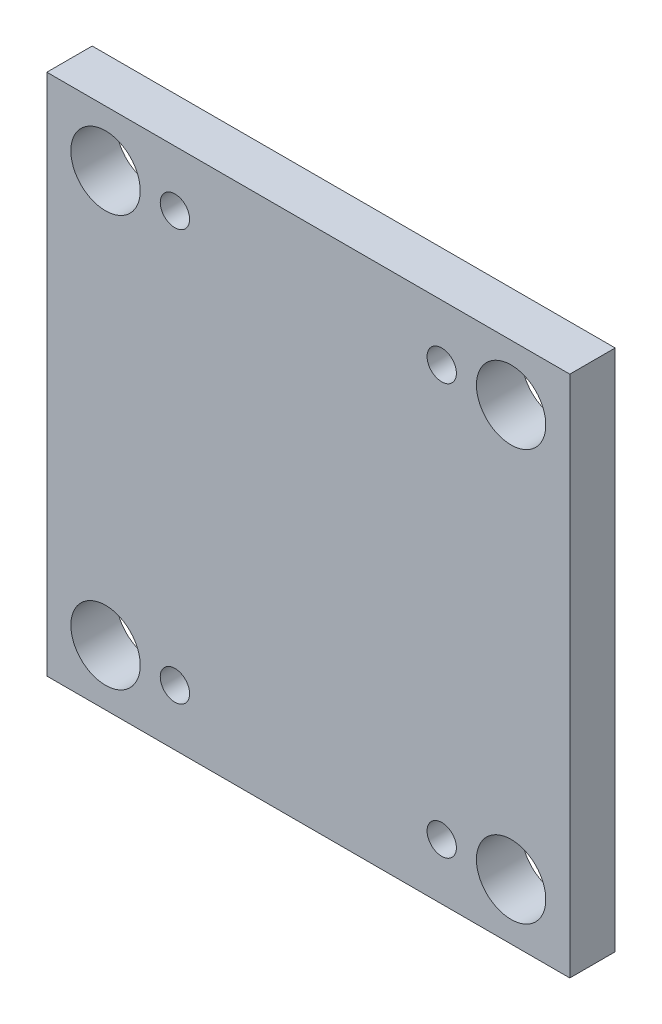
ISO-10303-21;
HEADER;
FILE_DESCRIPTION(('STEP AP214'),'2;1');
FILE_NAME('part.step','',(''),(''),'','','');
FILE_SCHEMA(('AUTOMOTIVE_DESIGN { 1 0 10303 214 1 1 1 1 }'));
ENDSEC;
DATA;
#1=APPLICATION_CONTEXT('core data for automotive mechanical design processes');
#2=APPLICATION_PROTOCOL_DEFINITION('international standard','automotive_design',2000,#1);
#3=PRODUCT_CONTEXT('',#1,'mechanical');
#4=PRODUCT('Part','Part','',(#3));
#5=PRODUCT_RELATED_PRODUCT_CATEGORY('part','',(#4));
#6=PRODUCT_DEFINITION_FORMATION('','',#4);
#7=PRODUCT_DEFINITION_CONTEXT('part definition',#1,'design');
#8=PRODUCT_DEFINITION('design','',#6,#7);
#9=PRODUCT_DEFINITION_SHAPE('','',#8);
#10=(LENGTH_UNIT() NAMED_UNIT(*) SI_UNIT(.MILLI.,.METRE.));
#11=(NAMED_UNIT(*) PLANE_ANGLE_UNIT() SI_UNIT($,.RADIAN.));
#12=(NAMED_UNIT(*) SI_UNIT($,.STERADIAN.) SOLID_ANGLE_UNIT());
#13=UNCERTAINTY_MEASURE_WITH_UNIT(LENGTH_MEASURE(1.E-05),#10,'distance_accuracy_value','');
#14=(GEOMETRIC_REPRESENTATION_CONTEXT(3) GLOBAL_UNCERTAINTY_ASSIGNED_CONTEXT((#13)) GLOBAL_UNIT_ASSIGNED_CONTEXT((#10,
#11,#12)) REPRESENTATION_CONTEXT('',''));
#15=CARTESIAN_POINT('',(0.,0.,0.));
#16=DIRECTION('',(0.,0.,1.));
#17=DIRECTION('',(1.,0.,0.));
#18=AXIS2_PLACEMENT_3D('',#15,#16,#17);
#19=CARTESIAN_POINT('',(98.,-98.,0.));
#20=DIRECTION('',(1.,0.,0.));
#21=DIRECTION('',(0.,0.,-1.));
#22=AXIS2_PLACEMENT_3D('',#19,#20,#21);
#23=PLANE('',#22);
#24=DIRECTION('',(0.,1.,0.));
#25=VECTOR('',#24,1.);
#26=CARTESIAN_POINT('',(98.,-98.,17.));
#27=LINE('',#26,#25);
#28=CARTESIAN_POINT('',(98.,-98.,17.));
#29=VERTEX_POINT('',#28);
#30=CARTESIAN_POINT('',(98.,98.,17.));
#31=VERTEX_POINT('',#30);
#32=EDGE_CURVE('E102',#29,#31,#27,.T.);
#33=ORIENTED_EDGE('',*,*,#32,.F.);
#34=DIRECTION('',(0.,0.,1.));
#35=VECTOR('',#34,1.);
#36=CARTESIAN_POINT('',(98.,-98.,0.));
#37=LINE('',#36,#35);
#38=CARTESIAN_POINT('',(98.,-98.,0.));
#39=VERTEX_POINT('',#38);
#40=EDGE_CURVE('E11',#39,#29,#37,.T.);
#41=ORIENTED_EDGE('',*,*,#40,.F.);
#42=DIRECTION('',(0.,1.,0.));
#43=VECTOR('',#42,1.);
#44=CARTESIAN_POINT('',(98.,-98.,0.));
#45=LINE('',#44,#43);
#46=CARTESIAN_POINT('',(98.,98.,0.));
#47=VERTEX_POINT('',#46);
#48=EDGE_CURVE('E95',#39,#47,#45,.T.);
#49=ORIENTED_EDGE('',*,*,#48,.T.);
#50=DIRECTION('',(0.,0.,1.));
#51=VECTOR('',#50,1.);
#52=CARTESIAN_POINT('',(98.,98.,0.));
#53=LINE('',#52,#51);
#54=EDGE_CURVE('E40',#47,#31,#53,.T.);
#55=ORIENTED_EDGE('',*,*,#54,.T.);
#56=EDGE_LOOP('',(#33,#41,#49,#55));
#57=FACE_BOUND('',#56,.T.);
#58=ADVANCED_FACE('F37',(#57),#23,.T.);
#59=CARTESIAN_POINT('',(-98.,-98.,0.));
#60=DIRECTION('',(0.,-1.,0.));
#61=DIRECTION('',(0.,0.,-1.));
#62=AXIS2_PLACEMENT_3D('',#59,#60,#61);
#63=PLANE('',#62);
#64=DIRECTION('',(1.,0.,0.));
#65=VECTOR('',#64,1.);
#66=CARTESIAN_POINT('',(-98.,-98.,17.));
#67=LINE('',#66,#65);
#68=CARTESIAN_POINT('',(-98.,-98.,17.));
#69=VERTEX_POINT('',#68);
#70=EDGE_CURVE('E97',#69,#29,#67,.T.);
#71=ORIENTED_EDGE('',*,*,#70,.F.);
#72=DIRECTION('',(0.,0.,1.));
#73=VECTOR('',#72,1.);
#74=CARTESIAN_POINT('',(-98.,-98.,0.));
#75=LINE('',#74,#73);
#76=CARTESIAN_POINT('',(-98.,-98.,0.));
#77=VERTEX_POINT('',#76);
#78=EDGE_CURVE('E46',#77,#69,#75,.T.);
#79=ORIENTED_EDGE('',*,*,#78,.F.);
#80=DIRECTION('',(1.,0.,0.));
#81=VECTOR('',#80,1.);
#82=CARTESIAN_POINT('',(-98.,-98.,0.));
#83=LINE('',#82,#81);
#84=EDGE_CURVE('E92',#77,#39,#83,.T.);
#85=ORIENTED_EDGE('',*,*,#84,.T.);
#86=ORIENTED_EDGE('',*,*,#40,.T.);
#87=EDGE_LOOP('',(#71,#79,#85,#86));
#88=FACE_BOUND('',#87,.T.);
#89=ADVANCED_FACE('F113',(#88),#63,.T.);
#90=CARTESIAN_POINT('',(-98.,98.,0.));
#91=DIRECTION('',(-1.,0.,0.));
#92=DIRECTION('',(0.,0.,1.));
#93=AXIS2_PLACEMENT_3D('',#90,#91,#92);
#94=PLANE('',#93);
#95=DIRECTION('',(0.,-1.,0.));
#96=VECTOR('',#95,1.);
#97=CARTESIAN_POINT('',(-98.,98.,17.));
#98=LINE('',#97,#96);
#99=CARTESIAN_POINT('',(-98.,98.,17.));
#100=VERTEX_POINT('',#99);
#101=EDGE_CURVE('E87',#100,#69,#98,.T.);
#102=ORIENTED_EDGE('',*,*,#101,.F.);
#103=DIRECTION('',(0.,0.,1.));
#104=VECTOR('',#103,1.);
#105=CARTESIAN_POINT('',(-98.,98.,0.));
#106=LINE('',#105,#104);
#107=CARTESIAN_POINT('',(-98.,98.,0.));
#108=VERTEX_POINT('',#107);
#109=EDGE_CURVE('E82',#108,#100,#106,.T.);
#110=ORIENTED_EDGE('',*,*,#109,.F.);
#111=DIRECTION('',(0.,-1.,0.));
#112=VECTOR('',#111,1.);
#113=CARTESIAN_POINT('',(-98.,98.,0.));
#114=LINE('',#113,#112);
#115=EDGE_CURVE('E85',#108,#77,#114,.T.);
#116=ORIENTED_EDGE('',*,*,#115,.T.);
#117=ORIENTED_EDGE('',*,*,#78,.T.);
#118=EDGE_LOOP('',(#102,#110,#116,#117));
#119=FACE_BOUND('',#118,.T.);
#120=ADVANCED_FACE('F84',(#119),#94,.T.);
#121=CARTESIAN_POINT('',(98.,98.,0.));
#122=DIRECTION('',(0.,1.,0.));
#123=DIRECTION('',(0.,0.,1.));
#124=AXIS2_PLACEMENT_3D('',#121,#122,#123);
#125=PLANE('',#124);
#126=DIRECTION('',(-1.,0.,0.));
#127=VECTOR('',#126,1.);
#128=CARTESIAN_POINT('',(98.,98.,17.));
#129=LINE('',#128,#127);
#130=EDGE_CURVE('E105',#31,#100,#129,.T.);
#131=ORIENTED_EDGE('',*,*,#130,.F.);
#132=ORIENTED_EDGE('',*,*,#54,.F.);
#133=DIRECTION('',(-1.,0.,0.));
#134=VECTOR('',#133,1.);
#135=CARTESIAN_POINT('',(98.,98.,0.));
#136=LINE('',#135,#134);
#137=EDGE_CURVE('E91',#47,#108,#136,.T.);
#138=ORIENTED_EDGE('',*,*,#137,.T.);
#139=ORIENTED_EDGE('',*,*,#109,.T.);
#140=EDGE_LOOP('',(#131,#132,#138,#139));
#141=FACE_BOUND('',#140,.T.);
#142=ADVANCED_FACE('F94',(#141),#125,.T.);
#143=CARTESIAN_POINT('',(0.,0.,0.));
#144=DIRECTION('',(0.,0.,1.));
#145=DIRECTION('',(1.,0.,0.));
#146=AXIS2_PLACEMENT_3D('',#143,#144,#145);
#147=PLANE('',#146);
#148=CARTESIAN_POINT('',(76.,77.,0.));
#149=DIRECTION('',(0.,0.,1.));
#150=DIRECTION('',(-1.,0.,0.));
#151=AXIS2_PLACEMENT_3D('',#148,#149,#150);
#152=CIRCLE('',#151,13.);
#153=CARTESIAN_POINT('',(63.,77.,0.));
#154=VERTEX_POINT('',#153);
#155=EDGE_CURVE('E170',#154,#154,#152,.T.);
#156=ORIENTED_EDGE('',*,*,#155,.T.);
#157=EDGE_LOOP('',(#156));
#158=FACE_BOUND('',#157,.T.);
#159=CARTESIAN_POINT('',(76.,-77.,0.));
#160=DIRECTION('',(0.,0.,1.));
#161=DIRECTION('',(-1.,0.,0.));
#162=AXIS2_PLACEMENT_3D('',#159,#160,#161);
#163=CIRCLE('',#162,13.);
#164=CARTESIAN_POINT('',(63.,-77.,0.));
#165=VERTEX_POINT('',#164);
#166=EDGE_CURVE('E178',#165,#165,#163,.T.);
#167=ORIENTED_EDGE('',*,*,#166,.T.);
#168=EDGE_LOOP('',(#167));
#169=FACE_BOUND('',#168,.T.);
#170=CARTESIAN_POINT('',(-76.,-77.,0.));
#171=DIRECTION('',(0.,0.,1.));
#172=DIRECTION('',(-1.,0.,0.));
#173=AXIS2_PLACEMENT_3D('',#170,#171,#172);
#174=CIRCLE('',#173,13.);
#175=CARTESIAN_POINT('',(-89.,-77.,0.));
#176=VERTEX_POINT('',#175);
#177=EDGE_CURVE('E184',#176,#176,#174,.T.);
#178=ORIENTED_EDGE('',*,*,#177,.T.);
#179=EDGE_LOOP('',(#178));
#180=FACE_BOUND('',#179,.T.);
#181=CARTESIAN_POINT('',(-76.,77.,0.));
#182=DIRECTION('',(0.,0.,1.));
#183=DIRECTION('',(-1.,0.,0.));
#184=AXIS2_PLACEMENT_3D('',#181,#182,#183);
#185=CIRCLE('',#184,13.);
#186=CARTESIAN_POINT('',(-89.,77.,0.));
#187=VERTEX_POINT('',#186);
#188=EDGE_CURVE('E190',#187,#187,#185,.T.);
#189=ORIENTED_EDGE('',*,*,#188,.T.);
#190=EDGE_LOOP('',(#189));
#191=FACE_BOUND('',#190,.T.);
#192=CARTESIAN_POINT('',(49.9999970794903,76.9998545898096,0.));
#193=DIRECTION('',(0.,0.,1.));
#194=DIRECTION('',(-1.,0.,0.));
#195=AXIS2_PLACEMENT_3D('',#192,#193,#194);
#196=CIRCLE('',#195,5.49999708141255);
#197=CARTESIAN_POINT('',(44.4999999980778,76.9998545898096,0.));
#198=VERTEX_POINT('',#197);
#199=EDGE_CURVE('E196',#198,#198,#196,.T.);
#200=ORIENTED_EDGE('',*,*,#199,.T.);
#201=EDGE_LOOP('',(#200));
#202=FACE_BOUND('',#201,.T.);
#203=CARTESIAN_POINT('',(50.,-77.,0.));
#204=DIRECTION('',(0.,0.,1.));
#205=DIRECTION('',(-1.,0.,0.));
#206=AXIS2_PLACEMENT_3D('',#203,#204,#205);
#207=CIRCLE('',#206,5.5);
#208=CARTESIAN_POINT('',(44.5,-77.,0.));
#209=VERTEX_POINT('',#208);
#210=EDGE_CURVE('E202',#209,#209,#207,.T.);
#211=ORIENTED_EDGE('',*,*,#210,.T.);
#212=EDGE_LOOP('',(#211));
#213=FACE_BOUND('',#212,.T.);
#214=CARTESIAN_POINT('',(-50.0000029205097,76.9998545898096,0.));
#215=DIRECTION('',(0.,0.,1.));
#216=DIRECTION('',(-1.,0.,0.));
#217=AXIS2_PLACEMENT_3D('',#214,#215,#216);
#218=CIRCLE('',#217,5.49999708141255);
#219=CARTESIAN_POINT('',(-55.5000000019222,76.9998545898096,0.));
#220=VERTEX_POINT('',#219);
#221=EDGE_CURVE('E208',#220,#220,#218,.T.);
#222=ORIENTED_EDGE('',*,*,#221,.T.);
#223=EDGE_LOOP('',(#222));
#224=FACE_BOUND('',#223,.T.);
#225=CARTESIAN_POINT('',(-50.,-77.,0.));
#226=DIRECTION('',(0.,0.,1.));
#227=DIRECTION('',(-1.,0.,0.));
#228=AXIS2_PLACEMENT_3D('',#225,#226,#227);
#229=CIRCLE('',#228,5.50000000000001);
#230=CARTESIAN_POINT('',(-55.5,-77.,0.));
#231=VERTEX_POINT('',#230);
#232=EDGE_CURVE('E106',#231,#231,#229,.T.);
#233=ORIENTED_EDGE('',*,*,#232,.T.);
#234=EDGE_LOOP('',(#233));
#235=FACE_BOUND('',#234,.T.);
#236=ORIENTED_EDGE('',*,*,#48,.F.);
#237=ORIENTED_EDGE('',*,*,#84,.F.);
#238=ORIENTED_EDGE('',*,*,#115,.F.);
#239=ORIENTED_EDGE('',*,*,#137,.F.);
#240=EDGE_LOOP('',(#236,#237,#238,#239));
#241=FACE_BOUND('',#240,.T.);
#242=ADVANCED_FACE('F90',(#158,#169,#180,#191,#202,#213,#224,#235,#241),#147,.F.);
#243=CARTESIAN_POINT('',(0.,0.,17.));
#244=DIRECTION('',(0.,0.,1.));
#245=DIRECTION('',(1.,0.,0.));
#246=AXIS2_PLACEMENT_3D('',#243,#244,#245);
#247=PLANE('',#246);
#248=CARTESIAN_POINT('',(76.,77.,17.));
#249=DIRECTION('',(0.,0.,1.));
#250=DIRECTION('',(-1.,0.,0.));
#251=AXIS2_PLACEMENT_3D('',#248,#249,#250);
#252=CIRCLE('',#251,13.);
#253=CARTESIAN_POINT('',(63.,77.,17.));
#254=VERTEX_POINT('',#253);
#255=EDGE_CURVE('E173',#254,#254,#252,.T.);
#256=ORIENTED_EDGE('',*,*,#255,.F.);
#257=EDGE_LOOP('',(#256));
#258=FACE_BOUND('',#257,.T.);
#259=CARTESIAN_POINT('',(76.,-77.,17.));
#260=DIRECTION('',(0.,0.,1.));
#261=DIRECTION('',(-1.,0.,0.));
#262=AXIS2_PLACEMENT_3D('',#259,#260,#261);
#263=CIRCLE('',#262,13.);
#264=CARTESIAN_POINT('',(63.,-77.,17.));
#265=VERTEX_POINT('',#264);
#266=EDGE_CURVE('E175',#265,#265,#263,.T.);
#267=ORIENTED_EDGE('',*,*,#266,.F.);
#268=EDGE_LOOP('',(#267));
#269=FACE_BOUND('',#268,.T.);
#270=CARTESIAN_POINT('',(-76.,-77.,17.));
#271=DIRECTION('',(0.,0.,1.));
#272=DIRECTION('',(-1.,0.,0.));
#273=AXIS2_PLACEMENT_3D('',#270,#271,#272);
#274=CIRCLE('',#273,13.);
#275=CARTESIAN_POINT('',(-89.,-77.,17.));
#276=VERTEX_POINT('',#275);
#277=EDGE_CURVE('E181',#276,#276,#274,.T.);
#278=ORIENTED_EDGE('',*,*,#277,.F.);
#279=EDGE_LOOP('',(#278));
#280=FACE_BOUND('',#279,.T.);
#281=CARTESIAN_POINT('',(-76.,77.,17.));
#282=DIRECTION('',(0.,0.,1.));
#283=DIRECTION('',(-1.,0.,0.));
#284=AXIS2_PLACEMENT_3D('',#281,#282,#283);
#285=CIRCLE('',#284,13.);
#286=CARTESIAN_POINT('',(-89.,77.,17.));
#287=VERTEX_POINT('',#286);
#288=EDGE_CURVE('E187',#287,#287,#285,.T.);
#289=ORIENTED_EDGE('',*,*,#288,.F.);
#290=EDGE_LOOP('',(#289));
#291=FACE_BOUND('',#290,.T.);
#292=CARTESIAN_POINT('',(49.9999970794903,76.9998545898096,17.));
#293=DIRECTION('',(0.,0.,1.));
#294=DIRECTION('',(-1.,0.,0.));
#295=AXIS2_PLACEMENT_3D('',#292,#293,#294);
#296=CIRCLE('',#295,5.49999708141255);
#297=CARTESIAN_POINT('',(44.4999999980778,76.9998545898096,17.));
#298=VERTEX_POINT('',#297);
#299=EDGE_CURVE('E193',#298,#298,#296,.T.);
#300=ORIENTED_EDGE('',*,*,#299,.F.);
#301=EDGE_LOOP('',(#300));
#302=FACE_BOUND('',#301,.T.);
#303=CARTESIAN_POINT('',(50.,-77.,17.));
#304=DIRECTION('',(0.,0.,1.));
#305=DIRECTION('',(-1.,0.,0.));
#306=AXIS2_PLACEMENT_3D('',#303,#304,#305);
#307=CIRCLE('',#306,5.5);
#308=CARTESIAN_POINT('',(44.5,-77.,17.));
#309=VERTEX_POINT('',#308);
#310=EDGE_CURVE('E199',#309,#309,#307,.T.);
#311=ORIENTED_EDGE('',*,*,#310,.F.);
#312=EDGE_LOOP('',(#311));
#313=FACE_BOUND('',#312,.T.);
#314=CARTESIAN_POINT('',(-50.0000029205097,76.9998545898096,17.));
#315=DIRECTION('',(0.,0.,1.));
#316=DIRECTION('',(-1.,0.,0.));
#317=AXIS2_PLACEMENT_3D('',#314,#315,#316);
#318=CIRCLE('',#317,5.49999708141255);
#319=CARTESIAN_POINT('',(-55.5000000019222,76.9998545898096,17.));
#320=VERTEX_POINT('',#319);
#321=EDGE_CURVE('E205',#320,#320,#318,.T.);
#322=ORIENTED_EDGE('',*,*,#321,.F.);
#323=EDGE_LOOP('',(#322));
#324=FACE_BOUND('',#323,.T.);
#325=CARTESIAN_POINT('',(-50.,-77.,17.));
#326=DIRECTION('',(0.,0.,1.));
#327=DIRECTION('',(-1.,0.,0.));
#328=AXIS2_PLACEMENT_3D('',#325,#326,#327);
#329=CIRCLE('',#328,5.50000000000001);
#330=CARTESIAN_POINT('',(-55.5,-77.,17.));
#331=VERTEX_POINT('',#330);
#332=EDGE_CURVE('E211',#331,#331,#329,.T.);
#333=ORIENTED_EDGE('',*,*,#332,.F.);
#334=EDGE_LOOP('',(#333));
#335=FACE_BOUND('',#334,.T.);
#336=ORIENTED_EDGE('',*,*,#32,.T.);
#337=ORIENTED_EDGE('',*,*,#130,.T.);
#338=ORIENTED_EDGE('',*,*,#101,.T.);
#339=ORIENTED_EDGE('',*,*,#70,.T.);
#340=EDGE_LOOP('',(#336,#337,#338,#339));
#341=FACE_BOUND('',#340,.T.);
#342=ADVANCED_FACE('F112',(#258,#269,#280,#291,#302,#313,#324,#335,#341),#247,.T.);
#343=CARTESIAN_POINT('',(-50.,-77.,0.));
#344=DIRECTION('',(0.,0.,1.));
#345=DIRECTION('',(1.,0.,0.));
#346=AXIS2_PLACEMENT_3D('',#343,#344,#345);
#347=CYLINDRICAL_SURFACE('',#346,5.50000000000001);
#348=ORIENTED_EDGE('',*,*,#232,.F.);
#349=EDGE_LOOP('',(#348));
#350=FACE_BOUND('',#349,.T.);
#351=ORIENTED_EDGE('',*,*,#332,.T.);
#352=EDGE_LOOP('',(#351));
#353=FACE_BOUND('',#352,.T.);
#354=ADVANCED_FACE('F131',(#350,#353),#347,.F.);
#355=CARTESIAN_POINT('',(-50.0000029205097,76.9998545898096,0.));
#356=DIRECTION('',(0.,0.,1.));
#357=DIRECTION('',(1.,0.,0.));
#358=AXIS2_PLACEMENT_3D('',#355,#356,#357);
#359=CYLINDRICAL_SURFACE('',#358,5.49999708141255);
#360=ORIENTED_EDGE('',*,*,#221,.F.);
#361=EDGE_LOOP('',(#360));
#362=FACE_BOUND('',#361,.T.);
#363=ORIENTED_EDGE('',*,*,#321,.T.);
#364=EDGE_LOOP('',(#363));
#365=FACE_BOUND('',#364,.T.);
#366=ADVANCED_FACE('F138',(#362,#365),#359,.F.);
#367=CARTESIAN_POINT('',(50.,-77.,0.));
#368=DIRECTION('',(0.,0.,1.));
#369=DIRECTION('',(1.,0.,0.));
#370=AXIS2_PLACEMENT_3D('',#367,#368,#369);
#371=CYLINDRICAL_SURFACE('',#370,5.5);
#372=ORIENTED_EDGE('',*,*,#210,.F.);
#373=EDGE_LOOP('',(#372));
#374=FACE_BOUND('',#373,.T.);
#375=ORIENTED_EDGE('',*,*,#310,.T.);
#376=EDGE_LOOP('',(#375));
#377=FACE_BOUND('',#376,.T.);
#378=ADVANCED_FACE('F142',(#374,#377),#371,.F.);
#379=CARTESIAN_POINT('',(49.9999970794903,76.9998545898096,0.));
#380=DIRECTION('',(0.,0.,1.));
#381=DIRECTION('',(1.,0.,0.));
#382=AXIS2_PLACEMENT_3D('',#379,#380,#381);
#383=CYLINDRICAL_SURFACE('',#382,5.49999708141255);
#384=ORIENTED_EDGE('',*,*,#199,.F.);
#385=EDGE_LOOP('',(#384));
#386=FACE_BOUND('',#385,.T.);
#387=ORIENTED_EDGE('',*,*,#299,.T.);
#388=EDGE_LOOP('',(#387));
#389=FACE_BOUND('',#388,.T.);
#390=ADVANCED_FACE('F146',(#386,#389),#383,.F.);
#391=CARTESIAN_POINT('',(-76.,77.,0.));
#392=DIRECTION('',(0.,0.,1.));
#393=DIRECTION('',(1.,0.,0.));
#394=AXIS2_PLACEMENT_3D('',#391,#392,#393);
#395=CYLINDRICAL_SURFACE('',#394,13.);
#396=ORIENTED_EDGE('',*,*,#188,.F.);
#397=EDGE_LOOP('',(#396));
#398=FACE_BOUND('',#397,.T.);
#399=ORIENTED_EDGE('',*,*,#288,.T.);
#400=EDGE_LOOP('',(#399));
#401=FACE_BOUND('',#400,.T.);
#402=ADVANCED_FACE('F150',(#398,#401),#395,.F.);
#403=CARTESIAN_POINT('',(-76.,-77.,0.));
#404=DIRECTION('',(0.,0.,1.));
#405=DIRECTION('',(1.,0.,0.));
#406=AXIS2_PLACEMENT_3D('',#403,#404,#405);
#407=CYLINDRICAL_SURFACE('',#406,13.);
#408=ORIENTED_EDGE('',*,*,#177,.F.);
#409=EDGE_LOOP('',(#408));
#410=FACE_BOUND('',#409,.T.);
#411=ORIENTED_EDGE('',*,*,#277,.T.);
#412=EDGE_LOOP('',(#411));
#413=FACE_BOUND('',#412,.T.);
#414=ADVANCED_FACE('F154',(#410,#413),#407,.F.);
#415=CARTESIAN_POINT('',(76.,-77.,0.));
#416=DIRECTION('',(0.,0.,1.));
#417=DIRECTION('',(1.,0.,0.));
#418=AXIS2_PLACEMENT_3D('',#415,#416,#417);
#419=CYLINDRICAL_SURFACE('',#418,13.);
#420=ORIENTED_EDGE('',*,*,#166,.F.);
#421=EDGE_LOOP('',(#420));
#422=FACE_BOUND('',#421,.T.);
#423=ORIENTED_EDGE('',*,*,#266,.T.);
#424=EDGE_LOOP('',(#423));
#425=FACE_BOUND('',#424,.T.);
#426=ADVANCED_FACE('F158',(#422,#425),#419,.F.);
#427=CARTESIAN_POINT('',(76.,77.,0.));
#428=DIRECTION('',(0.,0.,1.));
#429=DIRECTION('',(1.,0.,0.));
#430=AXIS2_PLACEMENT_3D('',#427,#428,#429);
#431=CYLINDRICAL_SURFACE('',#430,13.);
#432=ORIENTED_EDGE('',*,*,#155,.F.);
#433=EDGE_LOOP('',(#432));
#434=FACE_BOUND('',#433,.T.);
#435=ORIENTED_EDGE('',*,*,#255,.T.);
#436=EDGE_LOOP('',(#435));
#437=FACE_BOUND('',#436,.T.);
#438=ADVANCED_FACE('F162',(#434,#437),#431,.F.);
#439=CLOSED_SHELL('',(#58,#89,#120,#142,#242,#342,#354,#366,#378,#390,#402,#414,#426,#438));
#440=MANIFOLD_SOLID_BREP('B2',#439);
#441=ADVANCED_BREP_SHAPE_REPRESENTATION('',(#18,#440),#14);
#442=SHAPE_DEFINITION_REPRESENTATION(#9,#441);
ENDSEC;
END-ISO-10303-21;
